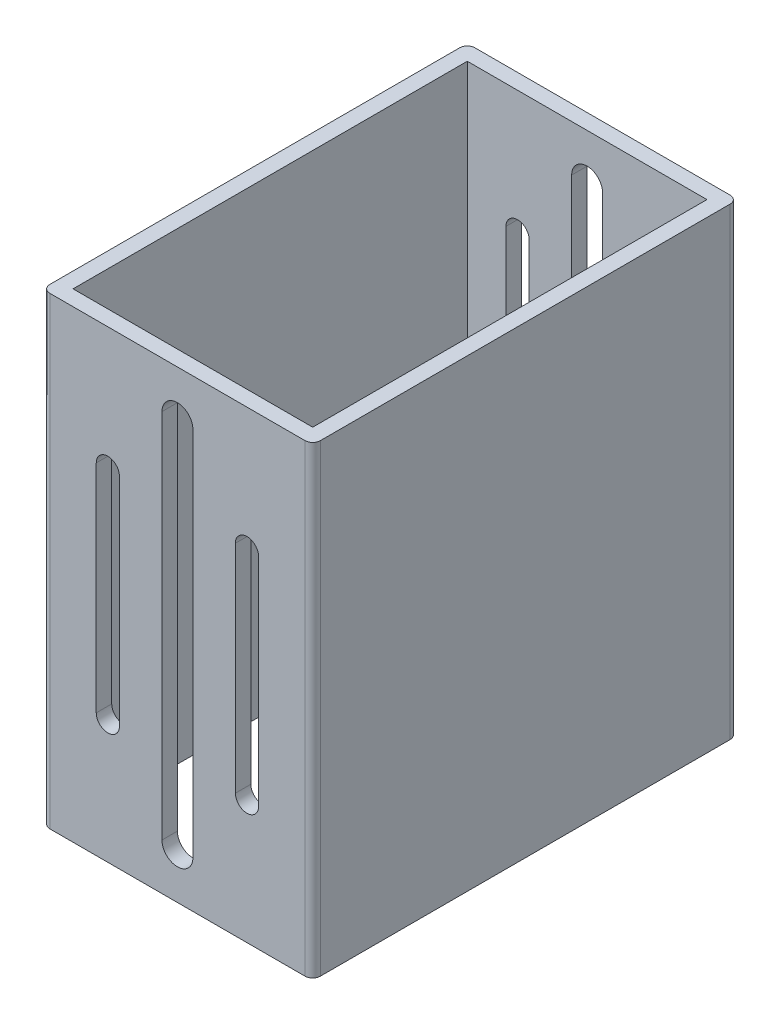
ISO-10303-21;
HEADER;
FILE_DESCRIPTION(('STEP AP214'),'2;1');
FILE_NAME('part.step','',(''),(''),'','','');
FILE_SCHEMA(('AUTOMOTIVE_DESIGN { 1 0 10303 214 1 1 1 1 }'));
ENDSEC;
DATA;
#1=APPLICATION_CONTEXT('core data for automotive mechanical design processes');
#2=APPLICATION_PROTOCOL_DEFINITION('international standard','automotive_design',2000,#1);
#3=PRODUCT_CONTEXT('',#1,'mechanical');
#4=PRODUCT('Part','Part','',(#3));
#5=PRODUCT_RELATED_PRODUCT_CATEGORY('part','',(#4));
#6=PRODUCT_DEFINITION_FORMATION('','',#4);
#7=PRODUCT_DEFINITION_CONTEXT('part definition',#1,'design');
#8=PRODUCT_DEFINITION('design','',#6,#7);
#9=PRODUCT_DEFINITION_SHAPE('','',#8);
#10=(LENGTH_UNIT() NAMED_UNIT(*) SI_UNIT(.MILLI.,.METRE.));
#11=(NAMED_UNIT(*) PLANE_ANGLE_UNIT() SI_UNIT($,.RADIAN.));
#12=(NAMED_UNIT(*) SI_UNIT($,.STERADIAN.) SOLID_ANGLE_UNIT());
#13=UNCERTAINTY_MEASURE_WITH_UNIT(LENGTH_MEASURE(1.E-05),#10,'distance_accuracy_value','');
#14=(GEOMETRIC_REPRESENTATION_CONTEXT(3) GLOBAL_UNCERTAINTY_ASSIGNED_CONTEXT((#13)) GLOBAL_UNIT_ASSIGNED_CONTEXT((#10,
#11,#12)) REPRESENTATION_CONTEXT('',''));
#15=CARTESIAN_POINT('',(0.,0.,0.));
#16=DIRECTION('',(0.,0.,1.));
#17=DIRECTION('',(1.,0.,0.));
#18=AXIS2_PLACEMENT_3D('',#15,#16,#17);
#19=CARTESIAN_POINT('',(1.,60.,-1.));
#20=DIRECTION('',(0.,1.,0.));
#21=DIRECTION('',(0.,0.,1.));
#22=AXIS2_PLACEMENT_3D('',#19,#20,#21);
#23=PLANE('',#22);
#24=CARTESIAN_POINT('',(1.,60.,-1.));
#25=DIRECTION('',(0.,1.,0.));
#26=DIRECTION('',(0.,0.,1.));
#27=AXIS2_PLACEMENT_3D('',#24,#25,#26);
#28=CIRCLE('',#27,1.);
#29=CARTESIAN_POINT('',(0.,60.,-1.00000000000001));
#30=VERTEX_POINT('',#29);
#31=CARTESIAN_POINT('',(1.00000000000001,60.,0.));
#32=VERTEX_POINT('',#31);
#33=EDGE_CURVE('E443',#30,#32,#28,.T.);
#34=ORIENTED_EDGE('',*,*,#33,.T.);
#35=DIRECTION('',(1.,0.,0.));
#36=VECTOR('',#35,1.);
#37=CARTESIAN_POINT('',(34.,60.,0.));
#38=LINE('',#37,#36);
#39=CARTESIAN_POINT('',(34.,60.,0.));
#40=VERTEX_POINT('',#39);
#41=EDGE_CURVE('E446',#32,#40,#38,.T.);
#42=ORIENTED_EDGE('',*,*,#41,.T.);
#43=CARTESIAN_POINT('',(34.,60.,-1.));
#44=DIRECTION('',(0.,1.,0.));
#45=DIRECTION('',(0.,0.,-1.));
#46=AXIS2_PLACEMENT_3D('',#43,#44,#45);
#47=CIRCLE('',#46,1.);
#48=CARTESIAN_POINT('',(35.,60.,-1.00000000000001));
#49=VERTEX_POINT('',#48);
#50=EDGE_CURVE('E449',#40,#49,#47,.T.);
#51=ORIENTED_EDGE('',*,*,#50,.T.);
#52=DIRECTION('',(0.,0.,-1.));
#53=VECTOR('',#52,1.);
#54=CARTESIAN_POINT('',(35.,60.,-54.));
#55=LINE('',#54,#53);
#56=CARTESIAN_POINT('',(35.,60.,-54.));
#57=VERTEX_POINT('',#56);
#58=EDGE_CURVE('E451',#49,#57,#55,.T.);
#59=ORIENTED_EDGE('',*,*,#58,.T.);
#60=CARTESIAN_POINT('',(34.,60.,-54.));
#61=DIRECTION('',(0.,1.,0.));
#62=DIRECTION('',(0.,0.,1.));
#63=AXIS2_PLACEMENT_3D('',#60,#61,#62);
#64=CIRCLE('',#63,1.);
#65=CARTESIAN_POINT('',(34.,60.,-55.));
#66=VERTEX_POINT('',#65);
#67=EDGE_CURVE('E453',#57,#66,#64,.T.);
#68=ORIENTED_EDGE('',*,*,#67,.T.);
#69=DIRECTION('',(-1.,0.,0.));
#70=VECTOR('',#69,1.);
#71=CARTESIAN_POINT('',(1.00000000000001,60.,-55.));
#72=LINE('',#71,#70);
#73=CARTESIAN_POINT('',(1.00000000000001,60.,-55.));
#74=VERTEX_POINT('',#73);
#75=EDGE_CURVE('E455',#66,#74,#72,.T.);
#76=ORIENTED_EDGE('',*,*,#75,.T.);
#77=CARTESIAN_POINT('',(1.,60.,-54.));
#78=DIRECTION('',(0.,1.,0.));
#79=DIRECTION('',(0.,0.,1.));
#80=AXIS2_PLACEMENT_3D('',#77,#78,#79);
#81=CIRCLE('',#80,1.);
#82=CARTESIAN_POINT('',(0.,60.,-54.));
#83=VERTEX_POINT('',#82);
#84=EDGE_CURVE('E457',#74,#83,#81,.T.);
#85=ORIENTED_EDGE('',*,*,#84,.T.);
#86=DIRECTION('',(0.,0.,1.));
#87=VECTOR('',#86,1.);
#88=CARTESIAN_POINT('',(0.,60.,-1.00000000000001));
#89=LINE('',#88,#87);
#90=EDGE_CURVE('E459',#83,#30,#89,.T.);
#91=ORIENTED_EDGE('',*,*,#90,.T.);
#92=EDGE_LOOP('',(#34,#42,#51,#59,#68,#76,#85,#91));
#93=FACE_BOUND('',#92,.T.);
#94=DIRECTION('',(1.,0.,0.));
#95=VECTOR('',#94,1.);
#96=CARTESIAN_POINT('',(33.,60.,-2.));
#97=LINE('',#96,#95);
#98=CARTESIAN_POINT('',(2.,60.,-2.));
#99=VERTEX_POINT('',#98);
#100=CARTESIAN_POINT('',(33.,60.,-2.));
#101=VERTEX_POINT('',#100);
#102=EDGE_CURVE('E414',#99,#101,#97,.T.);
#103=ORIENTED_EDGE('',*,*,#102,.F.);
#104=DIRECTION('',(0.,0.,1.));
#105=VECTOR('',#104,1.);
#106=CARTESIAN_POINT('',(2.,60.,-2.));
#107=LINE('',#106,#105);
#108=CARTESIAN_POINT('',(2.,60.,-53.));
#109=VERTEX_POINT('',#108);
#110=EDGE_CURVE('E412',#109,#99,#107,.T.);
#111=ORIENTED_EDGE('',*,*,#110,.F.);
#112=DIRECTION('',(-1.,0.,0.));
#113=VECTOR('',#112,1.);
#114=CARTESIAN_POINT('',(2.,60.,-53.));
#115=LINE('',#114,#113);
#116=CARTESIAN_POINT('',(33.,60.,-53.));
#117=VERTEX_POINT('',#116);
#118=EDGE_CURVE('E420',#117,#109,#115,.T.);
#119=ORIENTED_EDGE('',*,*,#118,.F.);
#120=DIRECTION('',(0.,0.,-1.));
#121=VECTOR('',#120,1.);
#122=CARTESIAN_POINT('',(33.,60.,-53.));
#123=LINE('',#122,#121);
#124=EDGE_CURVE('E417',#101,#117,#123,.T.);
#125=ORIENTED_EDGE('',*,*,#124,.F.);
#126=EDGE_LOOP('',(#103,#111,#119,#125));
#127=FACE_BOUND('',#126,.T.);
#128=ADVANCED_FACE('F34',(#93,#127),#23,.T.);
#129=CARTESIAN_POINT('',(1.,0.,-1.));
#130=DIRECTION('',(0.,1.,0.));
#131=DIRECTION('',(0.,0.,1.));
#132=AXIS2_PLACEMENT_3D('',#129,#130,#131);
#133=PLANE('',#132);
#134=CARTESIAN_POINT('',(1.,0.,-1.));
#135=DIRECTION('',(0.,1.,0.));
#136=DIRECTION('',(0.,0.,1.));
#137=AXIS2_PLACEMENT_3D('',#134,#135,#136);
#138=CIRCLE('',#137,1.);
#139=CARTESIAN_POINT('',(0.,0.,-1.00000000000001));
#140=VERTEX_POINT('',#139);
#141=CARTESIAN_POINT('',(1.00000000000001,0.,0.));
#142=VERTEX_POINT('',#141);
#143=EDGE_CURVE('E442',#140,#142,#138,.T.);
#144=ORIENTED_EDGE('',*,*,#143,.F.);
#145=DIRECTION('',(0.,0.,1.));
#146=VECTOR('',#145,1.);
#147=CARTESIAN_POINT('',(0.,0.,-1.00000000000001));
#148=LINE('',#147,#146);
#149=CARTESIAN_POINT('',(0.,0.,-54.));
#150=VERTEX_POINT('',#149);
#151=EDGE_CURVE('E447',#150,#140,#148,.T.);
#152=ORIENTED_EDGE('',*,*,#151,.F.);
#153=CARTESIAN_POINT('',(1.,0.,-54.));
#154=DIRECTION('',(0.,1.,0.));
#155=DIRECTION('',(0.,0.,1.));
#156=AXIS2_PLACEMENT_3D('',#153,#154,#155);
#157=CIRCLE('',#156,1.);
#158=CARTESIAN_POINT('',(1.00000000000001,0.,-55.));
#159=VERTEX_POINT('',#158);
#160=EDGE_CURVE('E474',#159,#150,#157,.T.);
#161=ORIENTED_EDGE('',*,*,#160,.F.);
#162=DIRECTION('',(-1.,0.,0.));
#163=VECTOR('',#162,1.);
#164=CARTESIAN_POINT('',(1.00000000000001,0.,-55.));
#165=LINE('',#164,#163);
#166=CARTESIAN_POINT('',(34.,0.,-55.));
#167=VERTEX_POINT('',#166);
#168=EDGE_CURVE('E472',#167,#159,#165,.T.);
#169=ORIENTED_EDGE('',*,*,#168,.F.);
#170=CARTESIAN_POINT('',(34.,0.,-54.));
#171=DIRECTION('',(0.,1.,0.));
#172=DIRECTION('',(0.,0.,1.));
#173=AXIS2_PLACEMENT_3D('',#170,#171,#172);
#174=CIRCLE('',#173,1.);
#175=CARTESIAN_POINT('',(35.,0.,-54.));
#176=VERTEX_POINT('',#175);
#177=EDGE_CURVE('E470',#176,#167,#174,.T.);
#178=ORIENTED_EDGE('',*,*,#177,.F.);
#179=DIRECTION('',(0.,0.,-1.));
#180=VECTOR('',#179,1.);
#181=CARTESIAN_POINT('',(35.,0.,-54.));
#182=LINE('',#181,#180);
#183=CARTESIAN_POINT('',(35.,0.,-1.00000000000001));
#184=VERTEX_POINT('',#183);
#185=EDGE_CURVE('E468',#184,#176,#182,.T.);
#186=ORIENTED_EDGE('',*,*,#185,.F.);
#187=CARTESIAN_POINT('',(34.,0.,-1.));
#188=DIRECTION('',(0.,1.,0.));
#189=DIRECTION('',(0.,0.,-1.));
#190=AXIS2_PLACEMENT_3D('',#187,#188,#189);
#191=CIRCLE('',#190,1.);
#192=CARTESIAN_POINT('',(34.,0.,0.));
#193=VERTEX_POINT('',#192);
#194=EDGE_CURVE('E466',#193,#184,#191,.T.);
#195=ORIENTED_EDGE('',*,*,#194,.F.);
#196=DIRECTION('',(1.,0.,0.));
#197=VECTOR('',#196,1.);
#198=CARTESIAN_POINT('',(34.,0.,0.));
#199=LINE('',#198,#197);
#200=EDGE_CURVE('E464',#142,#193,#199,.T.);
#201=ORIENTED_EDGE('',*,*,#200,.F.);
#202=EDGE_LOOP('',(#144,#152,#161,#169,#178,#186,#195,#201));
#203=FACE_BOUND('',#202,.T.);
#204=DIRECTION('',(0.,0.,1.));
#205=VECTOR('',#204,1.);
#206=CARTESIAN_POINT('',(2.,0.,-2.));
#207=LINE('',#206,#205);
#208=CARTESIAN_POINT('',(2.,0.,-53.));
#209=VERTEX_POINT('',#208);
#210=CARTESIAN_POINT('',(2.,0.,-2.));
#211=VERTEX_POINT('',#210);
#212=EDGE_CURVE('E411',#209,#211,#207,.T.);
#213=ORIENTED_EDGE('',*,*,#212,.T.);
#214=DIRECTION('',(1.,0.,0.));
#215=VECTOR('',#214,1.);
#216=CARTESIAN_POINT('',(33.,0.,-2.));
#217=LINE('',#216,#215);
#218=CARTESIAN_POINT('',(33.,0.,-2.));
#219=VERTEX_POINT('',#218);
#220=EDGE_CURVE('E425',#211,#219,#217,.T.);
#221=ORIENTED_EDGE('',*,*,#220,.T.);
#222=DIRECTION('',(0.,0.,-1.));
#223=VECTOR('',#222,1.);
#224=CARTESIAN_POINT('',(33.,0.,-53.));
#225=LINE('',#224,#223);
#226=CARTESIAN_POINT('',(33.,0.,-53.));
#227=VERTEX_POINT('',#226);
#228=EDGE_CURVE('E428',#219,#227,#225,.T.);
#229=ORIENTED_EDGE('',*,*,#228,.T.);
#230=DIRECTION('',(-1.,0.,0.));
#231=VECTOR('',#230,1.);
#232=CARTESIAN_POINT('',(2.,0.,-53.));
#233=LINE('',#232,#231);
#234=EDGE_CURVE('E415',#227,#209,#233,.T.);
#235=ORIENTED_EDGE('',*,*,#234,.T.);
#236=EDGE_LOOP('',(#213,#221,#229,#235));
#237=FACE_BOUND('',#236,.T.);
#238=ADVANCED_FACE('F564',(#203,#237),#133,.F.);
#239=CARTESIAN_POINT('',(1.,60.,-1.));
#240=DIRECTION('',(0.,-1.,0.));
#241=DIRECTION('',(0.,0.,-1.));
#242=AXIS2_PLACEMENT_3D('',#239,#240,#241);
#243=CYLINDRICAL_SURFACE('',#242,1.);
#244=ORIENTED_EDGE('',*,*,#143,.T.);
#245=DIRECTION('',(0.,-1.,0.));
#246=VECTOR('',#245,1.);
#247=CARTESIAN_POINT('',(1.00000000000001,60.,0.));
#248=LINE('',#247,#246);
#249=EDGE_CURVE('E497',#32,#142,#248,.T.);
#250=ORIENTED_EDGE('',*,*,#249,.F.);
#251=ORIENTED_EDGE('',*,*,#33,.F.);
#252=DIRECTION('',(0.,-1.,0.));
#253=VECTOR('',#252,1.);
#254=CARTESIAN_POINT('',(0.,60.,-1.00000000000001));
#255=LINE('',#254,#253);
#256=EDGE_CURVE('E461',#30,#140,#255,.T.);
#257=ORIENTED_EDGE('',*,*,#256,.T.);
#258=EDGE_LOOP('',(#244,#250,#251,#257));
#259=FACE_BOUND('',#258,.T.);
#260=ADVANCED_FACE('F36',(#259),#243,.T.);
#261=CARTESIAN_POINT('',(34.,60.,0.));
#262=DIRECTION('',(0.,0.,-1.));
#263=DIRECTION('',(-1.,0.,0.));
#264=AXIS2_PLACEMENT_3D('',#261,#262,#263);
#265=PLANE('',#264);
#266=DIRECTION('',(0.,-1.,0.));
#267=VECTOR('',#266,1.);
#268=CARTESIAN_POINT('',(25.,44.,0.));
#269=LINE('',#268,#267);
#270=CARTESIAN_POINT('',(25.,44.,0.));
#271=VERTEX_POINT('',#270);
#272=CARTESIAN_POINT('',(25.,16.,0.));
#273=VERTEX_POINT('',#272);
#274=EDGE_CURVE('E305',#271,#273,#269,.T.);
#275=ORIENTED_EDGE('',*,*,#274,.F.);
#276=CARTESIAN_POINT('',(26.5,44.,0.));
#277=DIRECTION('',(0.,0.,1.));
#278=DIRECTION('',(1.,0.,0.));
#279=AXIS2_PLACEMENT_3D('',#276,#277,#278);
#280=CIRCLE('',#279,1.5);
#281=CARTESIAN_POINT('',(28.,44.,0.));
#282=VERTEX_POINT('',#281);
#283=EDGE_CURVE('E49',#282,#271,#280,.T.);
#284=ORIENTED_EDGE('',*,*,#283,.F.);
#285=DIRECTION('',(0.,1.,0.));
#286=VECTOR('',#285,1.);
#287=CARTESIAN_POINT('',(28.,44.,0.));
#288=LINE('',#287,#286);
#289=CARTESIAN_POINT('',(28.,16.,0.));
#290=VERTEX_POINT('',#289);
#291=EDGE_CURVE('E311',#290,#282,#288,.T.);
#292=ORIENTED_EDGE('',*,*,#291,.F.);
#293=CARTESIAN_POINT('',(26.5,16.,0.));
#294=DIRECTION('',(0.,0.,1.));
#295=DIRECTION('',(1.,0.,0.));
#296=AXIS2_PLACEMENT_3D('',#293,#294,#295);
#297=CIRCLE('',#296,1.5);
#298=EDGE_CURVE('E308',#273,#290,#297,.T.);
#299=ORIENTED_EDGE('',*,*,#298,.F.);
#300=EDGE_LOOP('',(#275,#284,#292,#299));
#301=FACE_BOUND('',#300,.T.);
#302=DIRECTION('',(0.,1.,0.));
#303=VECTOR('',#302,1.);
#304=CARTESIAN_POINT('',(10.,44.,0.));
#305=LINE('',#304,#303);
#306=CARTESIAN_POINT('',(10.,16.,0.));
#307=VERTEX_POINT('',#306);
#308=CARTESIAN_POINT('',(10.,44.,0.));
#309=VERTEX_POINT('',#308);
#310=EDGE_CURVE('E284',#307,#309,#305,.T.);
#311=ORIENTED_EDGE('',*,*,#310,.F.);
#312=CARTESIAN_POINT('',(8.5,16.,0.));
#313=DIRECTION('',(0.,0.,1.));
#314=DIRECTION('',(-1.,0.,0.));
#315=AXIS2_PLACEMENT_3D('',#312,#313,#314);
#316=CIRCLE('',#315,1.5);
#317=CARTESIAN_POINT('',(7.,16.,0.));
#318=VERTEX_POINT('',#317);
#319=EDGE_CURVE('E57',#318,#307,#316,.T.);
#320=ORIENTED_EDGE('',*,*,#319,.F.);
#321=DIRECTION('',(0.,-1.,0.));
#322=VECTOR('',#321,1.);
#323=CARTESIAN_POINT('',(7.,44.,0.));
#324=LINE('',#323,#322);
#325=CARTESIAN_POINT('',(7.,44.,0.));
#326=VERTEX_POINT('',#325);
#327=EDGE_CURVE('E292',#326,#318,#324,.T.);
#328=ORIENTED_EDGE('',*,*,#327,.F.);
#329=CARTESIAN_POINT('',(8.5,44.,0.));
#330=DIRECTION('',(0.,0.,1.));
#331=DIRECTION('',(-1.,0.,0.));
#332=AXIS2_PLACEMENT_3D('',#329,#330,#331);
#333=CIRCLE('',#332,1.5);
#334=EDGE_CURVE('E274',#309,#326,#333,.T.);
#335=ORIENTED_EDGE('',*,*,#334,.F.);
#336=EDGE_LOOP('',(#311,#320,#328,#335));
#337=FACE_BOUND('',#336,.T.);
#338=DIRECTION('',(0.,-1.,0.));
#339=VECTOR('',#338,1.);
#340=CARTESIAN_POINT('',(15.5,54.,0.));
#341=LINE('',#340,#339);
#342=CARTESIAN_POINT('',(15.5,54.,0.));
#343=VERTEX_POINT('',#342);
#344=CARTESIAN_POINT('',(15.5,6.,0.));
#345=VERTEX_POINT('',#344);
#346=EDGE_CURVE('E328',#343,#345,#341,.T.);
#347=ORIENTED_EDGE('',*,*,#346,.F.);
#348=CARTESIAN_POINT('',(17.5,54.,0.));
#349=DIRECTION('',(0.,0.,1.));
#350=DIRECTION('',(1.,0.,0.));
#351=AXIS2_PLACEMENT_3D('',#348,#349,#350);
#352=CIRCLE('',#351,2.);
#353=CARTESIAN_POINT('',(19.5,54.,0.));
#354=VERTEX_POINT('',#353);
#355=EDGE_CURVE('E326',#354,#343,#352,.T.);
#356=ORIENTED_EDGE('',*,*,#355,.F.);
#357=DIRECTION('',(0.,1.,0.));
#358=VECTOR('',#357,1.);
#359=CARTESIAN_POINT('',(19.5,54.,0.));
#360=LINE('',#359,#358);
#361=CARTESIAN_POINT('',(19.5,6.,0.));
#362=VERTEX_POINT('',#361);
#363=EDGE_CURVE('E334',#362,#354,#360,.T.);
#364=ORIENTED_EDGE('',*,*,#363,.F.);
#365=CARTESIAN_POINT('',(17.5,6.,0.));
#366=DIRECTION('',(0.,0.,1.));
#367=DIRECTION('',(1.,0.,0.));
#368=AXIS2_PLACEMENT_3D('',#365,#366,#367);
#369=CIRCLE('',#368,2.);
#370=EDGE_CURVE('E331',#345,#362,#369,.T.);
#371=ORIENTED_EDGE('',*,*,#370,.F.);
#372=EDGE_LOOP('',(#347,#356,#364,#371));
#373=FACE_BOUND('',#372,.T.);
#374=ORIENTED_EDGE('',*,*,#200,.T.);
#375=DIRECTION('',(0.,-1.,0.));
#376=VECTOR('',#375,1.);
#377=CARTESIAN_POINT('',(34.,60.,0.));
#378=LINE('',#377,#376);
#379=EDGE_CURVE('E494',#40,#193,#378,.T.);
#380=ORIENTED_EDGE('',*,*,#379,.F.);
#381=ORIENTED_EDGE('',*,*,#41,.F.);
#382=ORIENTED_EDGE('',*,*,#249,.T.);
#383=EDGE_LOOP('',(#374,#380,#381,#382));
#384=FACE_BOUND('',#383,.T.);
#385=ADVANCED_FACE('F289',(#301,#337,#373,#384),#265,.F.);
#386=CARTESIAN_POINT('',(34.,60.,-1.));
#387=DIRECTION('',(0.,-1.,0.));
#388=DIRECTION('',(0.,0.,-1.));
#389=AXIS2_PLACEMENT_3D('',#386,#387,#388);
#390=CYLINDRICAL_SURFACE('',#389,1.);
#391=ORIENTED_EDGE('',*,*,#194,.T.);
#392=DIRECTION('',(0.,-1.,0.));
#393=VECTOR('',#392,1.);
#394=CARTESIAN_POINT('',(35.,60.,-1.00000000000001));
#395=LINE('',#394,#393);
#396=EDGE_CURVE('E491',#49,#184,#395,.T.);
#397=ORIENTED_EDGE('',*,*,#396,.F.);
#398=ORIENTED_EDGE('',*,*,#50,.F.);
#399=ORIENTED_EDGE('',*,*,#379,.T.);
#400=EDGE_LOOP('',(#391,#397,#398,#399));
#401=FACE_BOUND('',#400,.T.);
#402=ADVANCED_FACE('F587',(#401),#390,.T.);
#403=CARTESIAN_POINT('',(35.,60.,-54.));
#404=DIRECTION('',(-1.,0.,0.));
#405=DIRECTION('',(0.,0.,1.));
#406=AXIS2_PLACEMENT_3D('',#403,#404,#405);
#407=PLANE('',#406);
#408=ORIENTED_EDGE('',*,*,#185,.T.);
#409=DIRECTION('',(0.,-1.,0.));
#410=VECTOR('',#409,1.);
#411=CARTESIAN_POINT('',(35.,60.,-54.));
#412=LINE('',#411,#410);
#413=EDGE_CURVE('E488',#57,#176,#412,.T.);
#414=ORIENTED_EDGE('',*,*,#413,.F.);
#415=ORIENTED_EDGE('',*,*,#58,.F.);
#416=ORIENTED_EDGE('',*,*,#396,.T.);
#417=EDGE_LOOP('',(#408,#414,#415,#416));
#418=FACE_BOUND('',#417,.T.);
#419=ADVANCED_FACE('F583',(#418),#407,.F.);
#420=CARTESIAN_POINT('',(34.,60.,-54.));
#421=DIRECTION('',(0.,-1.,0.));
#422=DIRECTION('',(0.,0.,-1.));
#423=AXIS2_PLACEMENT_3D('',#420,#421,#422);
#424=CYLINDRICAL_SURFACE('',#423,1.);
#425=ORIENTED_EDGE('',*,*,#177,.T.);
#426=DIRECTION('',(0.,-1.,0.));
#427=VECTOR('',#426,1.);
#428=CARTESIAN_POINT('',(34.,60.,-55.));
#429=LINE('',#428,#427);
#430=EDGE_CURVE('E485',#66,#167,#429,.T.);
#431=ORIENTED_EDGE('',*,*,#430,.F.);
#432=ORIENTED_EDGE('',*,*,#67,.F.);
#433=ORIENTED_EDGE('',*,*,#413,.T.);
#434=EDGE_LOOP('',(#425,#431,#432,#433));
#435=FACE_BOUND('',#434,.T.);
#436=ADVANCED_FACE('F548',(#435),#424,.T.);
#437=CARTESIAN_POINT('',(1.00000000000001,60.,-55.));
#438=DIRECTION('',(0.,0.,1.));
#439=DIRECTION('',(1.,0.,0.));
#440=AXIS2_PLACEMENT_3D('',#437,#438,#439);
#441=PLANE('',#440);
#442=DIRECTION('',(0.,1.,0.));
#443=VECTOR('',#442,1.);
#444=CARTESIAN_POINT('',(28.,60.,-55.));
#445=LINE('',#444,#443);
#446=CARTESIAN_POINT('',(28.,16.,-55.));
#447=VERTEX_POINT('',#446);
#448=CARTESIAN_POINT('',(28.,44.,-55.));
#449=VERTEX_POINT('',#448);
#450=EDGE_CURVE('E403',#447,#449,#445,.T.);
#451=ORIENTED_EDGE('',*,*,#450,.T.);
#452=CARTESIAN_POINT('',(26.5,44.,-55.));
#453=DIRECTION('',(0.,0.,1.));
#454=DIRECTION('',(1.,0.,0.));
#455=AXIS2_PLACEMENT_3D('',#452,#453,#454);
#456=CIRCLE('',#455,1.5);
#457=CARTESIAN_POINT('',(25.,44.,-55.));
#458=VERTEX_POINT('',#457);
#459=EDGE_CURVE('E408',#449,#458,#456,.T.);
#460=ORIENTED_EDGE('',*,*,#459,.T.);
#461=DIRECTION('',(0.,-1.,0.));
#462=VECTOR('',#461,1.);
#463=CARTESIAN_POINT('',(25.,60.,-55.));
#464=LINE('',#463,#462);
#465=CARTESIAN_POINT('',(25.,16.,-55.));
#466=VERTEX_POINT('',#465);
#467=EDGE_CURVE('E392',#458,#466,#464,.T.);
#468=ORIENTED_EDGE('',*,*,#467,.T.);
#469=CARTESIAN_POINT('',(26.5,16.,-55.));
#470=DIRECTION('',(0.,0.,1.));
#471=DIRECTION('',(1.,0.,0.));
#472=AXIS2_PLACEMENT_3D('',#469,#470,#471);
#473=CIRCLE('',#472,1.5);
#474=EDGE_CURVE('E398',#466,#447,#473,.T.);
#475=ORIENTED_EDGE('',*,*,#474,.T.);
#476=EDGE_LOOP('',(#451,#460,#468,#475));
#477=FACE_BOUND('',#476,.T.);
#478=DIRECTION('',(0.,-1.,0.));
#479=VECTOR('',#478,1.);
#480=CARTESIAN_POINT('',(7.,60.,-55.));
#481=LINE('',#480,#479);
#482=CARTESIAN_POINT('',(7.,44.,-55.));
#483=VERTEX_POINT('',#482);
#484=CARTESIAN_POINT('',(7.,16.,-55.));
#485=VERTEX_POINT('',#484);
#486=EDGE_CURVE('E382',#483,#485,#481,.T.);
#487=ORIENTED_EDGE('',*,*,#486,.T.);
#488=CARTESIAN_POINT('',(8.5,16.,-55.));
#489=DIRECTION('',(0.,0.,1.));
#490=DIRECTION('',(1.,0.,0.));
#491=AXIS2_PLACEMENT_3D('',#488,#489,#490);
#492=CIRCLE('',#491,1.5);
#493=CARTESIAN_POINT('',(10.,16.,-55.));
#494=VERTEX_POINT('',#493);
#495=EDGE_CURVE('E387',#485,#494,#492,.T.);
#496=ORIENTED_EDGE('',*,*,#495,.T.);
#497=DIRECTION('',(0.,1.,0.));
#498=VECTOR('',#497,1.);
#499=CARTESIAN_POINT('',(10.,60.,-55.));
#500=LINE('',#499,#498);
#501=CARTESIAN_POINT('',(10.,44.,-55.));
#502=VERTEX_POINT('',#501);
#503=EDGE_CURVE('E373',#494,#502,#500,.T.);
#504=ORIENTED_EDGE('',*,*,#503,.T.);
#505=CARTESIAN_POINT('',(8.5,44.,-55.));
#506=DIRECTION('',(0.,0.,1.));
#507=DIRECTION('',(1.,0.,0.));
#508=AXIS2_PLACEMENT_3D('',#505,#506,#507);
#509=CIRCLE('',#508,1.5);
#510=EDGE_CURVE('E377',#502,#483,#509,.T.);
#511=ORIENTED_EDGE('',*,*,#510,.T.);
#512=EDGE_LOOP('',(#487,#496,#504,#511));
#513=FACE_BOUND('',#512,.T.);
#514=DIRECTION('',(0.,1.,0.));
#515=VECTOR('',#514,1.);
#516=CARTESIAN_POINT('',(19.5,60.,-55.));
#517=LINE('',#516,#515);
#518=CARTESIAN_POINT('',(19.5,6.,-55.));
#519=VERTEX_POINT('',#518);
#520=CARTESIAN_POINT('',(19.5,54.,-55.));
#521=VERTEX_POINT('',#520);
#522=EDGE_CURVE('E363',#519,#521,#517,.T.);
#523=ORIENTED_EDGE('',*,*,#522,.T.);
#524=CARTESIAN_POINT('',(17.5,54.,-55.));
#525=DIRECTION('',(0.,0.,1.));
#526=DIRECTION('',(1.,0.,0.));
#527=AXIS2_PLACEMENT_3D('',#524,#525,#526);
#528=CIRCLE('',#527,2.);
#529=CARTESIAN_POINT('',(15.5,54.,-55.));
#530=VERTEX_POINT('',#529);
#531=EDGE_CURVE('E368',#521,#530,#528,.T.);
#532=ORIENTED_EDGE('',*,*,#531,.T.);
#533=DIRECTION('',(0.,-1.,0.));
#534=VECTOR('',#533,1.);
#535=CARTESIAN_POINT('',(15.5,60.,-55.));
#536=LINE('',#535,#534);
#537=CARTESIAN_POINT('',(15.5,6.,-55.));
#538=VERTEX_POINT('',#537);
#539=EDGE_CURVE('E352',#530,#538,#536,.T.);
#540=ORIENTED_EDGE('',*,*,#539,.T.);
#541=CARTESIAN_POINT('',(17.5,6.,-55.));
#542=DIRECTION('',(0.,0.,1.));
#543=DIRECTION('',(1.,0.,0.));
#544=AXIS2_PLACEMENT_3D('',#541,#542,#543);
#545=CIRCLE('',#544,2.);
#546=EDGE_CURVE('E358',#538,#519,#545,.T.);
#547=ORIENTED_EDGE('',*,*,#546,.T.);
#548=EDGE_LOOP('',(#523,#532,#540,#547));
#549=FACE_BOUND('',#548,.T.);
#550=ORIENTED_EDGE('',*,*,#168,.T.);
#551=DIRECTION('',(0.,-1.,0.));
#552=VECTOR('',#551,1.);
#553=CARTESIAN_POINT('',(1.00000000000001,60.,-55.));
#554=LINE('',#553,#552);
#555=EDGE_CURVE('E482',#74,#159,#554,.T.);
#556=ORIENTED_EDGE('',*,*,#555,.F.);
#557=ORIENTED_EDGE('',*,*,#75,.F.);
#558=ORIENTED_EDGE('',*,*,#430,.T.);
#559=EDGE_LOOP('',(#550,#556,#557,#558));
#560=FACE_BOUND('',#559,.T.);
#561=ADVANCED_FACE('F544',(#477,#513,#549,#560),#441,.F.);
#562=CARTESIAN_POINT('',(1.,60.,-54.));
#563=DIRECTION('',(0.,-1.,0.));
#564=DIRECTION('',(0.,0.,-1.));
#565=AXIS2_PLACEMENT_3D('',#562,#563,#564);
#566=CYLINDRICAL_SURFACE('',#565,1.);
#567=ORIENTED_EDGE('',*,*,#160,.T.);
#568=DIRECTION('',(0.,-1.,0.));
#569=VECTOR('',#568,1.);
#570=CARTESIAN_POINT('',(0.,60.,-54.));
#571=LINE('',#570,#569);
#572=EDGE_CURVE('E479',#83,#150,#571,.T.);
#573=ORIENTED_EDGE('',*,*,#572,.F.);
#574=ORIENTED_EDGE('',*,*,#84,.F.);
#575=ORIENTED_EDGE('',*,*,#555,.T.);
#576=EDGE_LOOP('',(#567,#573,#574,#575));
#577=FACE_BOUND('',#576,.T.);
#578=ADVANCED_FACE('F547',(#577),#566,.T.);
#579=CARTESIAN_POINT('',(0.,60.,-1.00000000000001));
#580=DIRECTION('',(1.,0.,0.));
#581=DIRECTION('',(0.,0.,-1.));
#582=AXIS2_PLACEMENT_3D('',#579,#580,#581);
#583=PLANE('',#582);
#584=ORIENTED_EDGE('',*,*,#151,.T.);
#585=ORIENTED_EDGE('',*,*,#256,.F.);
#586=ORIENTED_EDGE('',*,*,#90,.F.);
#587=ORIENTED_EDGE('',*,*,#572,.T.);
#588=EDGE_LOOP('',(#584,#585,#586,#587));
#589=FACE_BOUND('',#588,.T.);
#590=ADVANCED_FACE('F568',(#589),#583,.F.);
#591=CARTESIAN_POINT('',(2.,60.,-2.));
#592=DIRECTION('',(1.,0.,0.));
#593=DIRECTION('',(0.,0.,-1.));
#594=AXIS2_PLACEMENT_3D('',#591,#592,#593);
#595=PLANE('',#594);
#596=ORIENTED_EDGE('',*,*,#212,.F.);
#597=DIRECTION('',(0.,-1.,0.));
#598=VECTOR('',#597,1.);
#599=CARTESIAN_POINT('',(2.,60.,-53.));
#600=LINE('',#599,#598);
#601=EDGE_CURVE('E422',#109,#209,#600,.T.);
#602=ORIENTED_EDGE('',*,*,#601,.F.);
#603=ORIENTED_EDGE('',*,*,#110,.T.);
#604=DIRECTION('',(0.,-1.,0.));
#605=VECTOR('',#604,1.);
#606=CARTESIAN_POINT('',(2.,60.,-2.));
#607=LINE('',#606,#605);
#608=EDGE_CURVE('E439',#99,#211,#607,.T.);
#609=ORIENTED_EDGE('',*,*,#608,.T.);
#610=EDGE_LOOP('',(#596,#602,#603,#609));
#611=FACE_BOUND('',#610,.T.);
#612=ADVANCED_FACE('F604',(#611),#595,.T.);
#613=CARTESIAN_POINT('',(33.,60.,-2.));
#614=DIRECTION('',(0.,0.,-1.));
#615=DIRECTION('',(-1.,0.,0.));
#616=AXIS2_PLACEMENT_3D('',#613,#614,#615);
#617=PLANE('',#616);
#618=CARTESIAN_POINT('',(26.5,44.,-2.));
#619=DIRECTION('',(0.,0.,-1.));
#620=DIRECTION('',(-1.,0.,0.));
#621=AXIS2_PLACEMENT_3D('',#618,#619,#620);
#622=CIRCLE('',#621,1.5);
#623=CARTESIAN_POINT('',(25.,44.,-2.));
#624=VERTEX_POINT('',#623);
#625=CARTESIAN_POINT('',(28.,44.,-2.));
#626=VERTEX_POINT('',#625);
#627=EDGE_CURVE('E406',#624,#626,#622,.T.);
#628=ORIENTED_EDGE('',*,*,#627,.F.);
#629=DIRECTION('',(0.,1.,0.));
#630=VECTOR('',#629,1.);
#631=CARTESIAN_POINT('',(25.,60.,-2.));
#632=LINE('',#631,#630);
#633=CARTESIAN_POINT('',(25.,16.,-2.));
#634=VERTEX_POINT('',#633);
#635=EDGE_CURVE('E390',#634,#624,#632,.T.);
#636=ORIENTED_EDGE('',*,*,#635,.F.);
#637=CARTESIAN_POINT('',(26.5,16.,-2.));
#638=DIRECTION('',(0.,0.,-1.));
#639=DIRECTION('',(-1.,0.,0.));
#640=AXIS2_PLACEMENT_3D('',#637,#638,#639);
#641=CIRCLE('',#640,1.5);
#642=CARTESIAN_POINT('',(28.,16.,-2.));
#643=VERTEX_POINT('',#642);
#644=EDGE_CURVE('E395',#643,#634,#641,.T.);
#645=ORIENTED_EDGE('',*,*,#644,.F.);
#646=DIRECTION('',(0.,-1.,0.));
#647=VECTOR('',#646,1.);
#648=CARTESIAN_POINT('',(28.,60.,-2.));
#649=LINE('',#648,#647);
#650=EDGE_CURVE('E401',#626,#643,#649,.T.);
#651=ORIENTED_EDGE('',*,*,#650,.F.);
#652=EDGE_LOOP('',(#628,#636,#645,#651));
#653=FACE_BOUND('',#652,.T.);
#654=CARTESIAN_POINT('',(8.5,16.,-2.));
#655=DIRECTION('',(0.,0.,-1.));
#656=DIRECTION('',(-1.,0.,0.));
#657=AXIS2_PLACEMENT_3D('',#654,#655,#656);
#658=CIRCLE('',#657,1.5);
#659=CARTESIAN_POINT('',(10.,16.,-2.));
#660=VERTEX_POINT('',#659);
#661=CARTESIAN_POINT('',(7.,16.,-2.));
#662=VERTEX_POINT('',#661);
#663=EDGE_CURVE('E385',#660,#662,#658,.T.);
#664=ORIENTED_EDGE('',*,*,#663,.F.);
#665=DIRECTION('',(0.,-1.,0.));
#666=VECTOR('',#665,1.);
#667=CARTESIAN_POINT('',(10.,60.,-2.));
#668=LINE('',#667,#666);
#669=CARTESIAN_POINT('',(10.,44.,-2.));
#670=VERTEX_POINT('',#669);
#671=EDGE_CURVE('E371',#670,#660,#668,.T.);
#672=ORIENTED_EDGE('',*,*,#671,.F.);
#673=CARTESIAN_POINT('',(8.5,44.,-2.));
#674=DIRECTION('',(0.,0.,-1.));
#675=DIRECTION('',(-1.,0.,0.));
#676=AXIS2_PLACEMENT_3D('',#673,#674,#675);
#677=CIRCLE('',#676,1.5);
#678=CARTESIAN_POINT('',(7.,44.,-2.));
#679=VERTEX_POINT('',#678);
#680=EDGE_CURVE('E277',#679,#670,#677,.T.);
#681=ORIENTED_EDGE('',*,*,#680,.F.);
#682=DIRECTION('',(0.,1.,0.));
#683=VECTOR('',#682,1.);
#684=CARTESIAN_POINT('',(7.00000000000001,60.,-2.));
#685=LINE('',#684,#683);
#686=EDGE_CURVE('E380',#662,#679,#685,.T.);
#687=ORIENTED_EDGE('',*,*,#686,.F.);
#688=EDGE_LOOP('',(#664,#672,#681,#687));
#689=FACE_BOUND('',#688,.T.);
#690=CARTESIAN_POINT('',(17.5,54.,-2.));
#691=DIRECTION('',(0.,0.,-1.));
#692=DIRECTION('',(-1.,0.,0.));
#693=AXIS2_PLACEMENT_3D('',#690,#691,#692);
#694=CIRCLE('',#693,2.);
#695=CARTESIAN_POINT('',(15.5,54.,-2.));
#696=VERTEX_POINT('',#695);
#697=CARTESIAN_POINT('',(19.5,54.,-2.));
#698=VERTEX_POINT('',#697);
#699=EDGE_CURVE('E366',#696,#698,#694,.T.);
#700=ORIENTED_EDGE('',*,*,#699,.F.);
#701=DIRECTION('',(0.,1.,0.));
#702=VECTOR('',#701,1.);
#703=CARTESIAN_POINT('',(15.5,60.,-2.));
#704=LINE('',#703,#702);
#705=CARTESIAN_POINT('',(15.5,6.,-2.));
#706=VERTEX_POINT('',#705);
#707=EDGE_CURVE('E350',#706,#696,#704,.T.);
#708=ORIENTED_EDGE('',*,*,#707,.F.);
#709=CARTESIAN_POINT('',(17.5,6.,-2.));
#710=DIRECTION('',(0.,0.,-1.));
#711=DIRECTION('',(-1.,0.,0.));
#712=AXIS2_PLACEMENT_3D('',#709,#710,#711);
#713=CIRCLE('',#712,2.);
#714=CARTESIAN_POINT('',(19.5,6.,-2.));
#715=VERTEX_POINT('',#714);
#716=EDGE_CURVE('E355',#715,#706,#713,.T.);
#717=ORIENTED_EDGE('',*,*,#716,.F.);
#718=DIRECTION('',(0.,-1.,0.));
#719=VECTOR('',#718,1.);
#720=CARTESIAN_POINT('',(19.5,60.,-2.));
#721=LINE('',#720,#719);
#722=EDGE_CURVE('E361',#698,#715,#721,.T.);
#723=ORIENTED_EDGE('',*,*,#722,.F.);
#724=EDGE_LOOP('',(#700,#708,#717,#723));
#725=FACE_BOUND('',#724,.T.);
#726=ORIENTED_EDGE('',*,*,#220,.F.);
#727=ORIENTED_EDGE('',*,*,#608,.F.);
#728=ORIENTED_EDGE('',*,*,#102,.T.);
#729=DIRECTION('',(0.,-1.,0.));
#730=VECTOR('',#729,1.);
#731=CARTESIAN_POINT('',(33.,60.,-2.));
#732=LINE('',#731,#730);
#733=EDGE_CURVE('E437',#101,#219,#732,.T.);
#734=ORIENTED_EDGE('',*,*,#733,.T.);
#735=EDGE_LOOP('',(#726,#727,#728,#734));
#736=FACE_BOUND('',#735,.T.);
#737=ADVANCED_FACE('F641',(#653,#689,#725,#736),#617,.T.);
#738=CARTESIAN_POINT('',(33.,60.,-53.));
#739=DIRECTION('',(-1.,0.,0.));
#740=DIRECTION('',(0.,0.,1.));
#741=AXIS2_PLACEMENT_3D('',#738,#739,#740);
#742=PLANE('',#741);
#743=ORIENTED_EDGE('',*,*,#228,.F.);
#744=ORIENTED_EDGE('',*,*,#733,.F.);
#745=ORIENTED_EDGE('',*,*,#124,.T.);
#746=DIRECTION('',(0.,-1.,0.));
#747=VECTOR('',#746,1.);
#748=CARTESIAN_POINT('',(33.,60.,-53.));
#749=LINE('',#748,#747);
#750=EDGE_CURVE('E435',#117,#227,#749,.T.);
#751=ORIENTED_EDGE('',*,*,#750,.T.);
#752=EDGE_LOOP('',(#743,#744,#745,#751));
#753=FACE_BOUND('',#752,.T.);
#754=ADVANCED_FACE('F648',(#753),#742,.T.);
#755=CARTESIAN_POINT('',(2.,60.,-53.));
#756=DIRECTION('',(0.,0.,1.));
#757=DIRECTION('',(1.,0.,0.));
#758=AXIS2_PLACEMENT_3D('',#755,#756,#757);
#759=PLANE('',#758);
#760=CARTESIAN_POINT('',(26.5,44.,-53.));
#761=DIRECTION('',(0.,0.,1.));
#762=DIRECTION('',(1.,0.,0.));
#763=AXIS2_PLACEMENT_3D('',#760,#761,#762);
#764=CIRCLE('',#763,1.5);
#765=CARTESIAN_POINT('',(28.,44.,-53.));
#766=VERTEX_POINT('',#765);
#767=CARTESIAN_POINT('',(25.,44.,-53.));
#768=VERTEX_POINT('',#767);
#769=EDGE_CURVE('E11',#766,#768,#764,.T.);
#770=ORIENTED_EDGE('',*,*,#769,.F.);
#771=DIRECTION('',(0.,1.,0.));
#772=VECTOR('',#771,1.);
#773=CARTESIAN_POINT('',(28.,60.,-53.));
#774=LINE('',#773,#772);
#775=CARTESIAN_POINT('',(28.,16.,-53.));
#776=VERTEX_POINT('',#775);
#777=EDGE_CURVE('E42',#776,#766,#774,.T.);
#778=ORIENTED_EDGE('',*,*,#777,.F.);
#779=CARTESIAN_POINT('',(26.5,16.,-53.));
#780=DIRECTION('',(0.,0.,1.));
#781=DIRECTION('',(1.,0.,0.));
#782=AXIS2_PLACEMENT_3D('',#779,#780,#781);
#783=CIRCLE('',#782,1.5);
#784=CARTESIAN_POINT('',(25.,16.,-53.));
#785=VERTEX_POINT('',#784);
#786=EDGE_CURVE('E520',#785,#776,#783,.T.);
#787=ORIENTED_EDGE('',*,*,#786,.F.);
#788=DIRECTION('',(0.,-1.,0.));
#789=VECTOR('',#788,1.);
#790=CARTESIAN_POINT('',(25.,60.,-53.));
#791=LINE('',#790,#789);
#792=EDGE_CURVE('E518',#768,#785,#791,.T.);
#793=ORIENTED_EDGE('',*,*,#792,.F.);
#794=EDGE_LOOP('',(#770,#778,#787,#793));
#795=FACE_BOUND('',#794,.T.);
#796=CARTESIAN_POINT('',(8.5,16.,-53.));
#797=DIRECTION('',(0.,0.,1.));
#798=DIRECTION('',(1.,0.,0.));
#799=AXIS2_PLACEMENT_3D('',#796,#797,#798);
#800=CIRCLE('',#799,1.5);
#801=CARTESIAN_POINT('',(7.,16.,-53.));
#802=VERTEX_POINT('',#801);
#803=CARTESIAN_POINT('',(10.,16.,-53.));
#804=VERTEX_POINT('',#803);
#805=EDGE_CURVE('E515',#802,#804,#800,.T.);
#806=ORIENTED_EDGE('',*,*,#805,.F.);
#807=DIRECTION('',(0.,-1.,0.));
#808=VECTOR('',#807,1.);
#809=CARTESIAN_POINT('',(7.,60.,-53.));
#810=LINE('',#809,#808);
#811=CARTESIAN_POINT('',(7.,44.,-53.));
#812=VERTEX_POINT('',#811);
#813=EDGE_CURVE('E513',#812,#802,#810,.T.);
#814=ORIENTED_EDGE('',*,*,#813,.F.);
#815=CARTESIAN_POINT('',(8.5,44.,-53.));
#816=DIRECTION('',(0.,0.,1.));
#817=DIRECTION('',(1.,0.,0.));
#818=AXIS2_PLACEMENT_3D('',#815,#816,#817);
#819=CIRCLE('',#818,1.5);
#820=CARTESIAN_POINT('',(10.,44.,-53.));
#821=VERTEX_POINT('',#820);
#822=EDGE_CURVE('E511',#821,#812,#819,.T.);
#823=ORIENTED_EDGE('',*,*,#822,.F.);
#824=DIRECTION('',(0.,1.,0.));
#825=VECTOR('',#824,1.);
#826=CARTESIAN_POINT('',(10.,60.,-53.));
#827=LINE('',#826,#825);
#828=EDGE_CURVE('E509',#804,#821,#827,.T.);
#829=ORIENTED_EDGE('',*,*,#828,.F.);
#830=EDGE_LOOP('',(#806,#814,#823,#829));
#831=FACE_BOUND('',#830,.T.);
#832=CARTESIAN_POINT('',(17.5,54.,-53.));
#833=DIRECTION('',(0.,0.,1.));
#834=DIRECTION('',(1.,0.,0.));
#835=AXIS2_PLACEMENT_3D('',#832,#833,#834);
#836=CIRCLE('',#835,2.);
#837=CARTESIAN_POINT('',(19.5,54.,-53.));
#838=VERTEX_POINT('',#837);
#839=CARTESIAN_POINT('',(15.5,54.,-53.));
#840=VERTEX_POINT('',#839);
#841=EDGE_CURVE('E506',#838,#840,#836,.T.);
#842=ORIENTED_EDGE('',*,*,#841,.F.);
#843=DIRECTION('',(0.,1.,0.));
#844=VECTOR('',#843,1.);
#845=CARTESIAN_POINT('',(19.5,60.,-53.));
#846=LINE('',#845,#844);
#847=CARTESIAN_POINT('',(19.5,6.,-53.));
#848=VERTEX_POINT('',#847);
#849=EDGE_CURVE('E504',#848,#838,#846,.T.);
#850=ORIENTED_EDGE('',*,*,#849,.F.);
#851=CARTESIAN_POINT('',(17.5,6.,-53.));
#852=DIRECTION('',(0.,0.,1.));
#853=DIRECTION('',(1.,0.,0.));
#854=AXIS2_PLACEMENT_3D('',#851,#852,#853);
#855=CIRCLE('',#854,2.);
#856=CARTESIAN_POINT('',(15.5,6.,-53.));
#857=VERTEX_POINT('',#856);
#858=EDGE_CURVE('E502',#857,#848,#855,.T.);
#859=ORIENTED_EDGE('',*,*,#858,.F.);
#860=DIRECTION('',(0.,-1.,0.));
#861=VECTOR('',#860,1.);
#862=CARTESIAN_POINT('',(15.5,60.,-53.));
#863=LINE('',#862,#861);
#864=EDGE_CURVE('E500',#840,#857,#863,.T.);
#865=ORIENTED_EDGE('',*,*,#864,.F.);
#866=EDGE_LOOP('',(#842,#850,#859,#865));
#867=FACE_BOUND('',#866,.T.);
#868=ORIENTED_EDGE('',*,*,#234,.F.);
#869=ORIENTED_EDGE('',*,*,#750,.F.);
#870=ORIENTED_EDGE('',*,*,#118,.T.);
#871=ORIENTED_EDGE('',*,*,#601,.T.);
#872=EDGE_LOOP('',(#868,#869,#870,#871));
#873=FACE_BOUND('',#872,.T.);
#874=ADVANCED_FACE('F535',(#795,#831,#867,#873),#759,.T.);
#875=CARTESIAN_POINT('',(15.5,54.,-60.));
#876=DIRECTION('',(-1.,0.,0.));
#877=DIRECTION('',(0.,0.,1.));
#878=AXIS2_PLACEMENT_3D('',#875,#876,#877);
#879=PLANE('',#878);
#880=DIRECTION('',(0.,0.,1.));
#881=VECTOR('',#880,1.);
#882=CARTESIAN_POINT('',(15.5,54.,-60.));
#883=LINE('',#882,#881);
#884=EDGE_CURVE('E347',#530,#840,#883,.T.);
#885=ORIENTED_EDGE('',*,*,#884,.T.);
#886=ORIENTED_EDGE('',*,*,#864,.T.);
#887=DIRECTION('',(0.,0.,1.));
#888=VECTOR('',#887,1.);
#889=CARTESIAN_POINT('',(15.5,6.,-60.));
#890=LINE('',#889,#888);
#891=EDGE_CURVE('E344',#538,#857,#890,.T.);
#892=ORIENTED_EDGE('',*,*,#891,.F.);
#893=ORIENTED_EDGE('',*,*,#539,.F.);
#894=EDGE_LOOP('',(#885,#886,#892,#893));
#895=FACE_BOUND('',#894,.T.);
#896=ADVANCED_FACE('F661',(#895),#879,.F.);
#897=CARTESIAN_POINT('',(17.5,6.,-60.));
#898=DIRECTION('',(0.,0.,1.));
#899=DIRECTION('',(1.,0.,0.));
#900=AXIS2_PLACEMENT_3D('',#897,#898,#899);
#901=CYLINDRICAL_SURFACE('',#900,2.);
#902=ORIENTED_EDGE('',*,*,#891,.T.);
#903=ORIENTED_EDGE('',*,*,#858,.T.);
#904=DIRECTION('',(0.,0.,1.));
#905=VECTOR('',#904,1.);
#906=CARTESIAN_POINT('',(19.5,6.,-60.));
#907=LINE('',#906,#905);
#908=EDGE_CURVE('E341',#519,#848,#907,.T.);
#909=ORIENTED_EDGE('',*,*,#908,.F.);
#910=ORIENTED_EDGE('',*,*,#546,.F.);
#911=EDGE_LOOP('',(#902,#903,#909,#910));
#912=FACE_BOUND('',#911,.T.);
#913=ADVANCED_FACE('F668',(#912),#901,.F.);
#914=CARTESIAN_POINT('',(19.5,54.,-60.));
#915=DIRECTION('',(1.,0.,0.));
#916=DIRECTION('',(0.,0.,-1.));
#917=AXIS2_PLACEMENT_3D('',#914,#915,#916);
#918=PLANE('',#917);
#919=ORIENTED_EDGE('',*,*,#908,.T.);
#920=ORIENTED_EDGE('',*,*,#849,.T.);
#921=DIRECTION('',(0.,0.,1.));
#922=VECTOR('',#921,1.);
#923=CARTESIAN_POINT('',(19.5,54.,-60.));
#924=LINE('',#923,#922);
#925=EDGE_CURVE('E340',#521,#838,#924,.T.);
#926=ORIENTED_EDGE('',*,*,#925,.F.);
#927=ORIENTED_EDGE('',*,*,#522,.F.);
#928=EDGE_LOOP('',(#919,#920,#926,#927));
#929=FACE_BOUND('',#928,.T.);
#930=ADVANCED_FACE('F677',(#929),#918,.F.);
#931=CARTESIAN_POINT('',(17.5,54.,-60.));
#932=DIRECTION('',(0.,0.,1.));
#933=DIRECTION('',(1.,0.,0.));
#934=AXIS2_PLACEMENT_3D('',#931,#932,#933);
#935=CYLINDRICAL_SURFACE('',#934,2.);
#936=ORIENTED_EDGE('',*,*,#925,.T.);
#937=ORIENTED_EDGE('',*,*,#841,.T.);
#938=ORIENTED_EDGE('',*,*,#884,.F.);
#939=ORIENTED_EDGE('',*,*,#531,.F.);
#940=EDGE_LOOP('',(#936,#937,#938,#939));
#941=FACE_BOUND('',#940,.T.);
#942=ADVANCED_FACE('F686',(#941),#935,.F.);
#943=CARTESIAN_POINT('',(10.,44.,-60.));
#944=DIRECTION('',(1.,0.,0.));
#945=DIRECTION('',(0.,1.,0.));
#946=AXIS2_PLACEMENT_3D('',#943,#944,#945);
#947=PLANE('',#946);
#948=DIRECTION('',(0.,0.,1.));
#949=VECTOR('',#948,1.);
#950=CARTESIAN_POINT('',(10.,16.,-60.));
#951=LINE('',#950,#949);
#952=EDGE_CURVE('E281',#494,#804,#951,.T.);
#953=ORIENTED_EDGE('',*,*,#952,.T.);
#954=ORIENTED_EDGE('',*,*,#828,.T.);
#955=DIRECTION('',(0.,0.,1.));
#956=VECTOR('',#955,1.);
#957=CARTESIAN_POINT('',(10.,44.,-60.));
#958=LINE('',#957,#956);
#959=EDGE_CURVE('E280',#502,#821,#958,.T.);
#960=ORIENTED_EDGE('',*,*,#959,.F.);
#961=ORIENTED_EDGE('',*,*,#503,.F.);
#962=EDGE_LOOP('',(#953,#954,#960,#961));
#963=FACE_BOUND('',#962,.T.);
#964=ADVANCED_FACE('F695',(#963),#947,.F.);
#965=CARTESIAN_POINT('',(8.5,44.,-60.));
#966=DIRECTION('',(0.,0.,1.));
#967=DIRECTION('',(1.,0.,0.));
#968=AXIS2_PLACEMENT_3D('',#965,#966,#967);
#969=CYLINDRICAL_SURFACE('',#968,1.5);
#970=ORIENTED_EDGE('',*,*,#959,.T.);
#971=ORIENTED_EDGE('',*,*,#822,.T.);
#972=DIRECTION('',(0.,0.,1.));
#973=VECTOR('',#972,1.);
#974=CARTESIAN_POINT('',(7.,44.,-60.));
#975=LINE('',#974,#973);
#976=EDGE_CURVE('E300',#483,#812,#975,.T.);
#977=ORIENTED_EDGE('',*,*,#976,.F.);
#978=ORIENTED_EDGE('',*,*,#510,.F.);
#979=EDGE_LOOP('',(#970,#971,#977,#978));
#980=FACE_BOUND('',#979,.T.);
#981=ADVANCED_FACE('F704',(#980),#969,.F.);
#982=CARTESIAN_POINT('',(7.,44.,-60.));
#983=DIRECTION('',(-1.,0.,0.));
#984=DIRECTION('',(0.,-1.,0.));
#985=AXIS2_PLACEMENT_3D('',#982,#983,#984);
#986=PLANE('',#985);
#987=ORIENTED_EDGE('',*,*,#976,.T.);
#988=ORIENTED_EDGE('',*,*,#813,.T.);
#989=DIRECTION('',(0.,0.,1.));
#990=VECTOR('',#989,1.);
#991=CARTESIAN_POINT('',(7.,16.,-60.));
#992=LINE('',#991,#990);
#993=EDGE_CURVE('E299',#485,#802,#992,.T.);
#994=ORIENTED_EDGE('',*,*,#993,.F.);
#995=ORIENTED_EDGE('',*,*,#486,.F.);
#996=EDGE_LOOP('',(#987,#988,#994,#995));
#997=FACE_BOUND('',#996,.T.);
#998=ADVANCED_FACE('F712',(#997),#986,.F.);
#999=CARTESIAN_POINT('',(8.5,16.,-60.));
#1000=DIRECTION('',(0.,0.,1.));
#1001=DIRECTION('',(1.,0.,0.));
#1002=AXIS2_PLACEMENT_3D('',#999,#1000,#1001);
#1003=CYLINDRICAL_SURFACE('',#1002,1.5);
#1004=ORIENTED_EDGE('',*,*,#993,.T.);
#1005=ORIENTED_EDGE('',*,*,#805,.T.);
#1006=ORIENTED_EDGE('',*,*,#952,.F.);
#1007=ORIENTED_EDGE('',*,*,#495,.F.);
#1008=EDGE_LOOP('',(#1004,#1005,#1006,#1007));
#1009=FACE_BOUND('',#1008,.T.);
#1010=ADVANCED_FACE('F720',(#1009),#1003,.F.);
#1011=CARTESIAN_POINT('',(25.,44.,-60.));
#1012=DIRECTION('',(-1.,0.,0.));
#1013=DIRECTION('',(0.,-1.,0.));
#1014=AXIS2_PLACEMENT_3D('',#1011,#1012,#1013);
#1015=PLANE('',#1014);
#1016=DIRECTION('',(0.,0.,1.));
#1017=VECTOR('',#1016,1.);
#1018=CARTESIAN_POINT('',(25.,44.,-60.));
#1019=LINE('',#1018,#1017);
#1020=EDGE_CURVE('E324',#458,#768,#1019,.T.);
#1021=ORIENTED_EDGE('',*,*,#1020,.T.);
#1022=ORIENTED_EDGE('',*,*,#792,.T.);
#1023=DIRECTION('',(0.,0.,1.));
#1024=VECTOR('',#1023,1.);
#1025=CARTESIAN_POINT('',(25.,16.,-60.));
#1026=LINE('',#1025,#1024);
#1027=EDGE_CURVE('E321',#466,#785,#1026,.T.);
#1028=ORIENTED_EDGE('',*,*,#1027,.F.);
#1029=ORIENTED_EDGE('',*,*,#467,.F.);
#1030=EDGE_LOOP('',(#1021,#1022,#1028,#1029));
#1031=FACE_BOUND('',#1030,.T.);
#1032=ADVANCED_FACE('F539',(#1031),#1015,.F.);
#1033=CARTESIAN_POINT('',(26.5,16.,-60.));
#1034=DIRECTION('',(0.,0.,1.));
#1035=DIRECTION('',(1.,0.,0.));
#1036=AXIS2_PLACEMENT_3D('',#1033,#1034,#1035);
#1037=CYLINDRICAL_SURFACE('',#1036,1.5);
#1038=ORIENTED_EDGE('',*,*,#1027,.T.);
#1039=ORIENTED_EDGE('',*,*,#786,.T.);
#1040=DIRECTION('',(0.,0.,1.));
#1041=VECTOR('',#1040,1.);
#1042=CARTESIAN_POINT('',(28.,16.,-60.));
#1043=LINE('',#1042,#1041);
#1044=EDGE_CURVE('E318',#447,#776,#1043,.T.);
#1045=ORIENTED_EDGE('',*,*,#1044,.F.);
#1046=ORIENTED_EDGE('',*,*,#474,.F.);
#1047=EDGE_LOOP('',(#1038,#1039,#1045,#1046));
#1048=FACE_BOUND('',#1047,.T.);
#1049=ADVANCED_FACE('F542',(#1048),#1037,.F.);
#1050=CARTESIAN_POINT('',(28.,44.,-60.));
#1051=DIRECTION('',(1.,0.,0.));
#1052=DIRECTION('',(0.,1.,0.));
#1053=AXIS2_PLACEMENT_3D('',#1050,#1051,#1052);
#1054=PLANE('',#1053);
#1055=ORIENTED_EDGE('',*,*,#1044,.T.);
#1056=ORIENTED_EDGE('',*,*,#777,.T.);
#1057=DIRECTION('',(0.,0.,1.));
#1058=VECTOR('',#1057,1.);
#1059=CARTESIAN_POINT('',(28.,44.,-60.));
#1060=LINE('',#1059,#1058);
#1061=EDGE_CURVE('E317',#449,#766,#1060,.T.);
#1062=ORIENTED_EDGE('',*,*,#1061,.F.);
#1063=ORIENTED_EDGE('',*,*,#450,.F.);
#1064=EDGE_LOOP('',(#1055,#1056,#1062,#1063));
#1065=FACE_BOUND('',#1064,.T.);
#1066=ADVANCED_FACE('F526',(#1065),#1054,.F.);
#1067=CARTESIAN_POINT('',(26.5,44.,-60.));
#1068=DIRECTION('',(0.,0.,1.));
#1069=DIRECTION('',(1.,0.,0.));
#1070=AXIS2_PLACEMENT_3D('',#1067,#1068,#1069);
#1071=CYLINDRICAL_SURFACE('',#1070,1.5);
#1072=ORIENTED_EDGE('',*,*,#1061,.T.);
#1073=ORIENTED_EDGE('',*,*,#769,.T.);
#1074=ORIENTED_EDGE('',*,*,#1020,.F.);
#1075=ORIENTED_EDGE('',*,*,#459,.F.);
#1076=EDGE_LOOP('',(#1072,#1073,#1074,#1075));
#1077=FACE_BOUND('',#1076,.T.);
#1078=ADVANCED_FACE('F532',(#1077),#1071,.F.);
#1079=ORIENTED_EDGE('',*,*,#699,.T.);
#1080=EDGE_CURVE('E338',#698,#354,#924,.T.);
#1081=ORIENTED_EDGE('',*,*,#1080,.T.);
#1082=ORIENTED_EDGE('',*,*,#355,.T.);
#1083=EDGE_CURVE('E337',#696,#343,#883,.T.);
#1084=ORIENTED_EDGE('',*,*,#1083,.F.);
#1085=EDGE_LOOP('',(#1079,#1081,#1082,#1084));
#1086=FACE_BOUND('',#1085,.T.);
#1087=ADVANCED_FACE('F698',(#1086),#935,.F.);
#1088=ORIENTED_EDGE('',*,*,#722,.T.);
#1089=EDGE_CURVE('E342',#715,#362,#907,.T.);
#1090=ORIENTED_EDGE('',*,*,#1089,.T.);
#1091=ORIENTED_EDGE('',*,*,#363,.T.);
#1092=ORIENTED_EDGE('',*,*,#1080,.F.);
#1093=EDGE_LOOP('',(#1088,#1090,#1091,#1092));
#1094=FACE_BOUND('',#1093,.T.);
#1095=ADVANCED_FACE('F689',(#1094),#918,.F.);
#1096=ORIENTED_EDGE('',*,*,#716,.T.);
#1097=EDGE_CURVE('E345',#706,#345,#890,.T.);
#1098=ORIENTED_EDGE('',*,*,#1097,.T.);
#1099=ORIENTED_EDGE('',*,*,#370,.T.);
#1100=ORIENTED_EDGE('',*,*,#1089,.F.);
#1101=EDGE_LOOP('',(#1096,#1098,#1099,#1100));
#1102=FACE_BOUND('',#1101,.T.);
#1103=ADVANCED_FACE('F680',(#1102),#901,.F.);
#1104=ORIENTED_EDGE('',*,*,#707,.T.);
#1105=ORIENTED_EDGE('',*,*,#1083,.T.);
#1106=ORIENTED_EDGE('',*,*,#346,.T.);
#1107=ORIENTED_EDGE('',*,*,#1097,.F.);
#1108=EDGE_LOOP('',(#1104,#1105,#1106,#1107));
#1109=FACE_BOUND('',#1108,.T.);
#1110=ADVANCED_FACE('F671',(#1109),#879,.F.);
#1111=ORIENTED_EDGE('',*,*,#663,.T.);
#1112=EDGE_CURVE('E297',#662,#318,#992,.T.);
#1113=ORIENTED_EDGE('',*,*,#1112,.T.);
#1114=ORIENTED_EDGE('',*,*,#319,.T.);
#1115=EDGE_CURVE('E286',#660,#307,#951,.T.);
#1116=ORIENTED_EDGE('',*,*,#1115,.F.);
#1117=EDGE_LOOP('',(#1111,#1113,#1114,#1116));
#1118=FACE_BOUND('',#1117,.T.);
#1119=ADVANCED_FACE('F731',(#1118),#1003,.F.);
#1120=ORIENTED_EDGE('',*,*,#686,.T.);
#1121=EDGE_CURVE('E301',#679,#326,#975,.T.);
#1122=ORIENTED_EDGE('',*,*,#1121,.T.);
#1123=ORIENTED_EDGE('',*,*,#327,.T.);
#1124=ORIENTED_EDGE('',*,*,#1112,.F.);
#1125=EDGE_LOOP('',(#1120,#1122,#1123,#1124));
#1126=FACE_BOUND('',#1125,.T.);
#1127=ADVANCED_FACE('F723',(#1126),#986,.F.);
#1128=ORIENTED_EDGE('',*,*,#680,.T.);
#1129=EDGE_CURVE('E269',#670,#309,#958,.T.);
#1130=ORIENTED_EDGE('',*,*,#1129,.T.);
#1131=ORIENTED_EDGE('',*,*,#334,.T.);
#1132=ORIENTED_EDGE('',*,*,#1121,.F.);
#1133=EDGE_LOOP('',(#1128,#1130,#1131,#1132));
#1134=FACE_BOUND('',#1133,.T.);
#1135=ADVANCED_FACE('F271',(#1134),#969,.F.);
#1136=ORIENTED_EDGE('',*,*,#671,.T.);
#1137=ORIENTED_EDGE('',*,*,#1115,.T.);
#1138=ORIENTED_EDGE('',*,*,#310,.T.);
#1139=ORIENTED_EDGE('',*,*,#1129,.F.);
#1140=EDGE_LOOP('',(#1136,#1137,#1138,#1139));
#1141=FACE_BOUND('',#1140,.T.);
#1142=ADVANCED_FACE('F285',(#1141),#947,.F.);
#1143=ORIENTED_EDGE('',*,*,#627,.T.);
#1144=EDGE_CURVE('E315',#626,#282,#1060,.T.);
#1145=ORIENTED_EDGE('',*,*,#1144,.T.);
#1146=ORIENTED_EDGE('',*,*,#283,.T.);
#1147=EDGE_CURVE('E314',#624,#271,#1019,.T.);
#1148=ORIENTED_EDGE('',*,*,#1147,.F.);
#1149=EDGE_LOOP('',(#1143,#1145,#1146,#1148));
#1150=FACE_BOUND('',#1149,.T.);
#1151=ADVANCED_FACE('F759',(#1150),#1071,.F.);
#1152=ORIENTED_EDGE('',*,*,#650,.T.);
#1153=EDGE_CURVE('E319',#643,#290,#1043,.T.);
#1154=ORIENTED_EDGE('',*,*,#1153,.T.);
#1155=ORIENTED_EDGE('',*,*,#291,.T.);
#1156=ORIENTED_EDGE('',*,*,#1144,.F.);
#1157=EDGE_LOOP('',(#1152,#1154,#1155,#1156));
#1158=FACE_BOUND('',#1157,.T.);
#1159=ADVANCED_FACE('F752',(#1158),#1054,.F.);
#1160=ORIENTED_EDGE('',*,*,#644,.T.);
#1161=EDGE_CURVE('E322',#634,#273,#1026,.T.);
#1162=ORIENTED_EDGE('',*,*,#1161,.T.);
#1163=ORIENTED_EDGE('',*,*,#298,.T.);
#1164=ORIENTED_EDGE('',*,*,#1153,.F.);
#1165=EDGE_LOOP('',(#1160,#1162,#1163,#1164));
#1166=FACE_BOUND('',#1165,.T.);
#1167=ADVANCED_FACE('F745',(#1166),#1037,.F.);
#1168=ORIENTED_EDGE('',*,*,#635,.T.);
#1169=ORIENTED_EDGE('',*,*,#1147,.T.);
#1170=ORIENTED_EDGE('',*,*,#274,.T.);
#1171=ORIENTED_EDGE('',*,*,#1161,.F.);
#1172=EDGE_LOOP('',(#1168,#1169,#1170,#1171));
#1173=FACE_BOUND('',#1172,.T.);
#1174=ADVANCED_FACE('F738',(#1173),#1015,.F.);
#1175=CLOSED_SHELL('',(#128,#238,#260,#385,#402,#419,#436,#561,#578,#590,#612,#737,#754,#874,
#896,#913,#930,#942,#964,#981,#998,#1010,#1032,#1049,#1066,#1078,#1087,#1095,#1103,#1110,#1119,
#1127,#1135,#1142,#1151,#1159,#1167,#1174));
#1176=MANIFOLD_SOLID_BREP('B2',#1175);
#1177=ADVANCED_BREP_SHAPE_REPRESENTATION('',(#18,#1176),#14);
#1178=SHAPE_DEFINITION_REPRESENTATION(#9,#1177);
ENDSEC;
END-ISO-10303-21;
